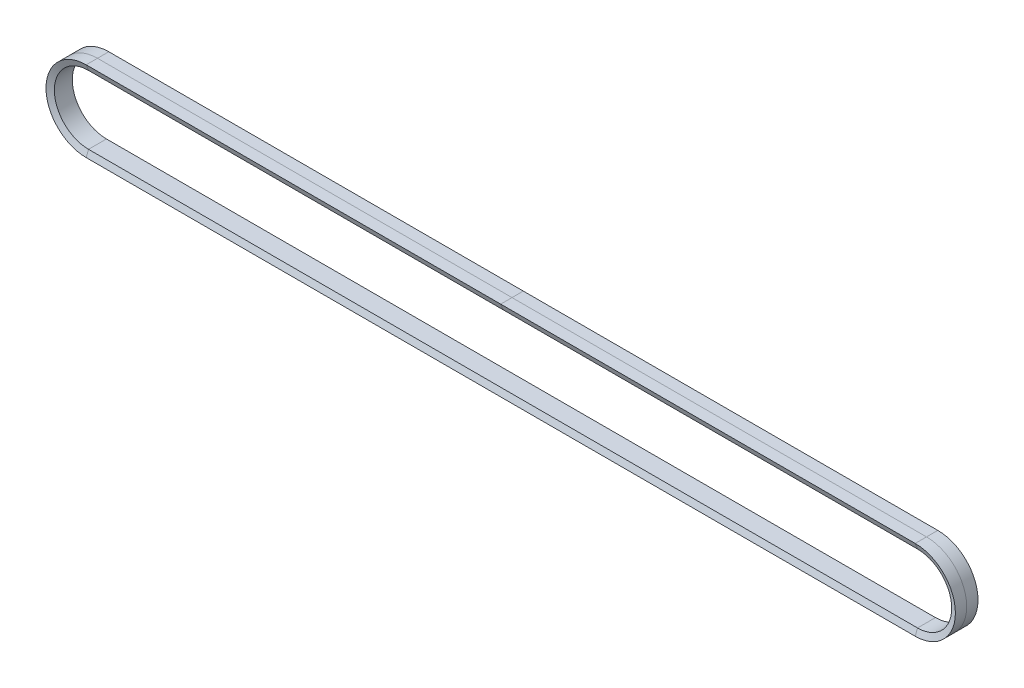
ISO-10303-21;
HEADER;
FILE_DESCRIPTION(('STEP AP214'),'2;1');
FILE_NAME('part.step','',(''),(''),'','','');
FILE_SCHEMA(('AUTOMOTIVE_DESIGN { 1 0 10303 214 1 1 1 1 }'));
ENDSEC;
DATA;
#1=APPLICATION_CONTEXT('core data for automotive mechanical design processes');
#2=APPLICATION_PROTOCOL_DEFINITION('international standard','automotive_design',2000,#1);
#3=PRODUCT_CONTEXT('',#1,'mechanical');
#4=PRODUCT('Part','Part','',(#3));
#5=PRODUCT_RELATED_PRODUCT_CATEGORY('part','',(#4));
#6=PRODUCT_DEFINITION_FORMATION('','',#4);
#7=PRODUCT_DEFINITION_CONTEXT('part definition',#1,'design');
#8=PRODUCT_DEFINITION('design','',#6,#7);
#9=PRODUCT_DEFINITION_SHAPE('','',#8);
#10=(LENGTH_UNIT() NAMED_UNIT(*) SI_UNIT(.MILLI.,.METRE.));
#11=(NAMED_UNIT(*) PLANE_ANGLE_UNIT() SI_UNIT($,.RADIAN.));
#12=(NAMED_UNIT(*) SI_UNIT($,.STERADIAN.) SOLID_ANGLE_UNIT());
#13=UNCERTAINTY_MEASURE_WITH_UNIT(LENGTH_MEASURE(1.E-05),#10,'distance_accuracy_value','');
#14=(GEOMETRIC_REPRESENTATION_CONTEXT(3) GLOBAL_UNCERTAINTY_ASSIGNED_CONTEXT((#13)) GLOBAL_UNIT_ASSIGNED_CONTEXT((#10,
#11,#12)) REPRESENTATION_CONTEXT('',''));
#15=CARTESIAN_POINT('',(0.,0.,0.));
#16=DIRECTION('',(0.,0.,1.));
#17=DIRECTION('',(1.,0.,0.));
#18=AXIS2_PLACEMENT_3D('',#15,#16,#17);
#19=CARTESIAN_POINT('',(-165.,13.5999999999999,3.57046223112381));
#20=DIRECTION('',(0.,-0.361164913100604,0.932501960075706));
#21=DIRECTION('',(0.,-0.932501960075706,-0.361164913100604));
#22=AXIS2_PLACEMENT_3D('',#19,#20,#21);
#23=PLANE('',#22);
#24=DIRECTION('',(1.,0.,0.));
#25=VECTOR('',#24,1.);
#26=CARTESIAN_POINT('',(-165.,15.9999999999999,4.5));
#27=LINE('',#26,#25);
#28=CARTESIAN_POINT('',(-165.,15.9999999999999,4.5));
#29=VERTEX_POINT('',#28);
#30=CARTESIAN_POINT('',(0.,15.9999999999999,4.5));
#31=VERTEX_POINT('',#30);
#32=EDGE_CURVE('E11',#29,#31,#27,.T.);
#33=ORIENTED_EDGE('',*,*,#32,.F.);
#34=DIRECTION('',(0.,-0.932501960075706,-0.361164913100604));
#35=VECTOR('',#34,1.);
#36=CARTESIAN_POINT('',(-165.,13.5999999999999,3.57046223112381));
#37=LINE('',#36,#35);
#38=CARTESIAN_POINT('',(-165.,13.5999999999999,3.57046223112381));
#39=VERTEX_POINT('',#38);
#40=EDGE_CURVE('E42',#29,#39,#37,.T.);
#41=ORIENTED_EDGE('',*,*,#40,.T.);
#42=DIRECTION('',(1.,0.,0.));
#43=VECTOR('',#42,1.);
#44=CARTESIAN_POINT('',(-165.,13.5999999999999,3.57046223112381));
#45=LINE('',#44,#43);
#46=CARTESIAN_POINT('',(0.,13.5999999999999,3.57046223112381));
#47=VERTEX_POINT('',#46);
#48=EDGE_CURVE('E158',#39,#47,#45,.T.);
#49=ORIENTED_EDGE('',*,*,#48,.T.);
#50=DIRECTION('',(0.,-0.932501960075706,-0.361164913100604));
#51=VECTOR('',#50,1.);
#52=CARTESIAN_POINT('',(0.,13.5999999999999,3.57046223112381));
#53=LINE('',#52,#51);
#54=EDGE_CURVE('E161',#31,#47,#53,.T.);
#55=ORIENTED_EDGE('',*,*,#54,.F.);
#56=EDGE_LOOP('',(#33,#41,#49,#55));
#57=FACE_BOUND('',#56,.T.);
#58=ADVANCED_FACE('F39',(#57),#23,.T.);
#59=CARTESIAN_POINT('',(-165.,15.9999999999999,4.5));
#60=DIRECTION('',(0.,1.,0.));
#61=DIRECTION('',(-1.,0.,0.));
#62=AXIS2_PLACEMENT_3D('',#59,#60,#61);
#63=PLANE('',#62);
#64=DIRECTION('',(1.,0.,0.));
#65=VECTOR('',#64,1.);
#66=CARTESIAN_POINT('',(-165.,15.9999999999999,0.));
#67=LINE('',#66,#65);
#68=CARTESIAN_POINT('',(-165.,15.9999999999999,0.));
#69=VERTEX_POINT('',#68);
#70=CARTESIAN_POINT('',(0.,15.9999999999999,0.));
#71=VERTEX_POINT('',#70);
#72=EDGE_CURVE('E48',#69,#71,#67,.T.);
#73=ORIENTED_EDGE('',*,*,#72,.F.);
#74=DIRECTION('',(0.,0.,1.));
#75=VECTOR('',#74,1.);
#76=CARTESIAN_POINT('',(-165.,15.9999999999999,4.5));
#77=LINE('',#76,#75);
#78=EDGE_CURVE('E304',#69,#29,#77,.T.);
#79=ORIENTED_EDGE('',*,*,#78,.T.);
#80=ORIENTED_EDGE('',*,*,#32,.T.);
#81=DIRECTION('',(0.,0.,1.));
#82=VECTOR('',#81,1.);
#83=CARTESIAN_POINT('',(0.,15.9999999999999,4.5));
#84=LINE('',#83,#82);
#85=EDGE_CURVE('E189',#71,#31,#84,.T.);
#86=ORIENTED_EDGE('',*,*,#85,.F.);
#87=EDGE_LOOP('',(#73,#79,#80,#86));
#88=FACE_BOUND('',#87,.T.);
#89=ADVANCED_FACE('F367',(#88),#63,.T.);
#90=CARTESIAN_POINT('',(-165.,15.9999999999999,0.));
#91=DIRECTION('',(0.,1.,0.));
#92=DIRECTION('',(-1.,0.,0.));
#93=AXIS2_PLACEMENT_3D('',#90,#91,#92);
#94=PLANE('',#93);
#95=DIRECTION('',(1.,0.,0.));
#96=VECTOR('',#95,1.);
#97=CARTESIAN_POINT('',(-165.,15.9999999999999,-4.5));
#98=LINE('',#97,#96);
#99=CARTESIAN_POINT('',(-165.,15.9999999999999,-4.5));
#100=VERTEX_POINT('',#99);
#101=CARTESIAN_POINT('',(0.,15.9999999999999,-4.5));
#102=VERTEX_POINT('',#101);
#103=EDGE_CURVE('E244',#100,#102,#98,.T.);
#104=ORIENTED_EDGE('',*,*,#103,.F.);
#105=DIRECTION('',(0.,0.,1.));
#106=VECTOR('',#105,1.);
#107=CARTESIAN_POINT('',(-165.,15.9999999999999,0.));
#108=LINE('',#107,#106);
#109=EDGE_CURVE('E271',#100,#69,#108,.T.);
#110=ORIENTED_EDGE('',*,*,#109,.T.);
#111=ORIENTED_EDGE('',*,*,#72,.T.);
#112=DIRECTION('',(0.,0.,1.));
#113=VECTOR('',#112,1.);
#114=CARTESIAN_POINT('',(0.,15.9999999999999,0.));
#115=LINE('',#114,#113);
#116=EDGE_CURVE('E198',#102,#71,#115,.T.);
#117=ORIENTED_EDGE('',*,*,#116,.F.);
#118=EDGE_LOOP('',(#104,#110,#111,#117));
#119=FACE_BOUND('',#118,.T.);
#120=ADVANCED_FACE('F371',(#119),#94,.T.);
#121=CARTESIAN_POINT('',(-165.,15.9999999999999,-4.5));
#122=DIRECTION('',(0.,-0.361164913100604,-0.932501960075706));
#123=DIRECTION('',(0.,0.932501960075706,-0.361164913100604));
#124=AXIS2_PLACEMENT_3D('',#121,#122,#123);
#125=PLANE('',#124);
#126=DIRECTION('',(1.,0.,0.));
#127=VECTOR('',#126,1.);
#128=CARTESIAN_POINT('',(-165.,13.5999999999999,-3.57046223112381));
#129=LINE('',#128,#127);
#130=CARTESIAN_POINT('',(-165.,13.5999999999999,-3.57046223112381));
#131=VERTEX_POINT('',#130);
#132=CARTESIAN_POINT('',(0.,13.5999999999999,-3.57046223112381));
#133=VERTEX_POINT('',#132);
#134=EDGE_CURVE('E168',#131,#133,#129,.T.);
#135=ORIENTED_EDGE('',*,*,#134,.F.);
#136=DIRECTION('',(0.,0.932501960075706,-0.361164913100604));
#137=VECTOR('',#136,1.);
#138=CARTESIAN_POINT('',(-165.,15.9999999999999,-4.5));
#139=LINE('',#138,#137);
#140=EDGE_CURVE('E238',#131,#100,#139,.T.);
#141=ORIENTED_EDGE('',*,*,#140,.T.);
#142=ORIENTED_EDGE('',*,*,#103,.T.);
#143=DIRECTION('',(0.,0.932501960075706,-0.361164913100604));
#144=VECTOR('',#143,1.);
#145=CARTESIAN_POINT('',(0.,15.9999999999999,-4.5));
#146=LINE('',#145,#144);
#147=EDGE_CURVE('E194',#133,#102,#146,.T.);
#148=ORIENTED_EDGE('',*,*,#147,.F.);
#149=EDGE_LOOP('',(#135,#141,#142,#148));
#150=FACE_BOUND('',#149,.T.);
#151=ADVANCED_FACE('F376',(#150),#125,.T.);
#152=CARTESIAN_POINT('',(-165.,0.,4.5));
#153=DIRECTION('',(0.,0.,1.));
#154=DIRECTION('',(1.,0.,0.));
#155=AXIS2_PLACEMENT_3D('',#152,#153,#154);
#156=CONICAL_SURFACE('',#155,15.9999999999999,1.20127950115753);
#157=ORIENTED_EDGE('',*,*,#40,.F.);
#158=CARTESIAN_POINT('',(-165.,0.,4.5));
#159=DIRECTION('',(0.,0.,-1.));
#160=DIRECTION('',(0.,-1.,0.));
#161=AXIS2_PLACEMENT_3D('',#158,#159,#160);
#162=CIRCLE('',#161,15.9999999999999);
#163=CARTESIAN_POINT('',(-165.,-16.,4.5));
#164=VERTEX_POINT('',#163);
#165=EDGE_CURVE('E327',#164,#29,#162,.T.);
#166=ORIENTED_EDGE('',*,*,#165,.F.);
#167=DIRECTION('',(0.,0.932501960075706,-0.361164913100604));
#168=VECTOR('',#167,1.);
#169=CARTESIAN_POINT('',(-165.,-13.6,3.57046223112381));
#170=LINE('',#169,#168);
#171=CARTESIAN_POINT('',(-165.,-13.6,3.57046223112381));
#172=VERTEX_POINT('',#171);
#173=EDGE_CURVE('E242',#164,#172,#170,.T.);
#174=ORIENTED_EDGE('',*,*,#173,.T.);
#175=CARTESIAN_POINT('',(-165.,0.,3.57046223112381));
#176=DIRECTION('',(0.,0.,-1.));
#177=DIRECTION('',(0.,-1.,0.));
#178=AXIS2_PLACEMENT_3D('',#175,#176,#177);
#179=CIRCLE('',#178,13.5999999999999);
#180=EDGE_CURVE('E234',#172,#39,#179,.T.);
#181=ORIENTED_EDGE('',*,*,#180,.T.);
#182=EDGE_LOOP('',(#157,#166,#174,#181));
#183=FACE_BOUND('',#182,.T.);
#184=ADVANCED_FACE('F341',(#183),#156,.F.);
#185=CARTESIAN_POINT('',(-165.,0.,0.));
#186=DIRECTION('',(0.,0.,-1.));
#187=DIRECTION('',(-1.,0.,0.));
#188=AXIS2_PLACEMENT_3D('',#185,#186,#187);
#189=CYLINDRICAL_SURFACE('',#188,15.9999999999999);
#190=ORIENTED_EDGE('',*,*,#165,.T.);
#191=ORIENTED_EDGE('',*,*,#78,.F.);
#192=CARTESIAN_POINT('',(-165.,0.,0.));
#193=DIRECTION('',(0.,0.,-1.));
#194=DIRECTION('',(0.,-1.,0.));
#195=AXIS2_PLACEMENT_3D('',#192,#193,#194);
#196=CIRCLE('',#195,15.9999999999999);
#197=CARTESIAN_POINT('',(-165.,-16.,0.));
#198=VERTEX_POINT('',#197);
#199=EDGE_CURVE('E300',#198,#69,#196,.T.);
#200=ORIENTED_EDGE('',*,*,#199,.F.);
#201=DIRECTION('',(0.,0.,1.));
#202=VECTOR('',#201,1.);
#203=CARTESIAN_POINT('',(-165.,-16.,4.5));
#204=LINE('',#203,#202);
#205=EDGE_CURVE('E294',#198,#164,#204,.T.);
#206=ORIENTED_EDGE('',*,*,#205,.T.);
#207=EDGE_LOOP('',(#190,#191,#200,#206));
#208=FACE_BOUND('',#207,.T.);
#209=ADVANCED_FACE('F381',(#208),#189,.T.);
#210=CARTESIAN_POINT('',(-165.,0.,0.));
#211=DIRECTION('',(0.,0.,-1.));
#212=DIRECTION('',(-1.,0.,0.));
#213=AXIS2_PLACEMENT_3D('',#210,#211,#212);
#214=CYLINDRICAL_SURFACE('',#213,15.9999999999999);
#215=ORIENTED_EDGE('',*,*,#199,.T.);
#216=ORIENTED_EDGE('',*,*,#109,.F.);
#217=CARTESIAN_POINT('',(-165.,0.,-4.5));
#218=DIRECTION('',(0.,0.,-1.));
#219=DIRECTION('',(0.,-1.,0.));
#220=AXIS2_PLACEMENT_3D('',#217,#218,#219);
#221=CIRCLE('',#220,15.9999999999999);
#222=CARTESIAN_POINT('',(-165.,-16.,-4.5));
#223=VERTEX_POINT('',#222);
#224=EDGE_CURVE('E267',#223,#100,#221,.T.);
#225=ORIENTED_EDGE('',*,*,#224,.F.);
#226=DIRECTION('',(0.,0.,1.));
#227=VECTOR('',#226,1.);
#228=CARTESIAN_POINT('',(-165.,-16.,0.));
#229=LINE('',#228,#227);
#230=EDGE_CURVE('E261',#223,#198,#229,.T.);
#231=ORIENTED_EDGE('',*,*,#230,.T.);
#232=EDGE_LOOP('',(#215,#216,#225,#231));
#233=FACE_BOUND('',#232,.T.);
#234=ADVANCED_FACE('F398',(#233),#214,.T.);
#235=CARTESIAN_POINT('',(-165.,0.,-3.57046223112381));
#236=DIRECTION('',(0.,0.,-1.));
#237=DIRECTION('',(-1.,0.,0.));
#238=AXIS2_PLACEMENT_3D('',#235,#236,#237);
#239=CONICAL_SURFACE('',#238,13.5999999999999,1.20127950115753);
#240=ORIENTED_EDGE('',*,*,#224,.T.);
#241=ORIENTED_EDGE('',*,*,#140,.F.);
#242=CARTESIAN_POINT('',(-165.,0.,-3.57046223112381));
#243=DIRECTION('',(0.,0.,-1.));
#244=DIRECTION('',(0.,-1.,0.));
#245=AXIS2_PLACEMENT_3D('',#242,#243,#244);
#246=CIRCLE('',#245,13.5999999999999);
#247=CARTESIAN_POINT('',(-165.,-13.6,-3.57046223112381));
#248=VERTEX_POINT('',#247);
#249=EDGE_CURVE('E233',#248,#131,#246,.T.);
#250=ORIENTED_EDGE('',*,*,#249,.F.);
#251=DIRECTION('',(0.,-0.932501960075706,-0.361164913100604));
#252=VECTOR('',#251,1.);
#253=CARTESIAN_POINT('',(-165.,-16.,-4.5));
#254=LINE('',#253,#252);
#255=EDGE_CURVE('E223',#248,#223,#254,.T.);
#256=ORIENTED_EDGE('',*,*,#255,.T.);
#257=EDGE_LOOP('',(#240,#241,#250,#256));
#258=FACE_BOUND('',#257,.T.);
#259=ADVANCED_FACE('F351',(#258),#239,.F.);
#260=CARTESIAN_POINT('',(-165.,0.,0.));
#261=DIRECTION('',(0.,0.,-1.));
#262=DIRECTION('',(-1.,0.,0.));
#263=AXIS2_PLACEMENT_3D('',#260,#261,#262);
#264=CYLINDRICAL_SURFACE('',#263,13.5999999999999);
#265=ORIENTED_EDGE('',*,*,#249,.T.);
#266=DIRECTION('',(0.,0.,-1.));
#267=VECTOR('',#266,1.);
#268=CARTESIAN_POINT('',(-165.,13.5999999999999,-3.57046223112381));
#269=LINE('',#268,#267);
#270=EDGE_CURVE('E230',#39,#131,#269,.T.);
#271=ORIENTED_EDGE('',*,*,#270,.F.);
#272=ORIENTED_EDGE('',*,*,#180,.F.);
#273=DIRECTION('',(0.,0.,-1.));
#274=VECTOR('',#273,1.);
#275=CARTESIAN_POINT('',(-165.,-13.6,-3.57046223112381));
#276=LINE('',#275,#274);
#277=EDGE_CURVE('E219',#172,#248,#276,.T.);
#278=ORIENTED_EDGE('',*,*,#277,.T.);
#279=EDGE_LOOP('',(#265,#271,#272,#278));
#280=FACE_BOUND('',#279,.T.);
#281=ADVANCED_FACE('F348',(#280),#264,.F.);
#282=CARTESIAN_POINT('',(165.,-13.5999999999999,3.57046223112381));
#283=DIRECTION('',(0.,0.361164913100604,0.932501960075706));
#284=DIRECTION('',(0.,-0.932501960075706,0.361164913100604));
#285=AXIS2_PLACEMENT_3D('',#282,#283,#284);
#286=PLANE('',#285);
#287=ORIENTED_EDGE('',*,*,#173,.F.);
#288=DIRECTION('',(-1.,0.,0.));
#289=VECTOR('',#288,1.);
#290=CARTESIAN_POINT('',(165.,-15.9999999999999,4.5));
#291=LINE('',#290,#289);
#292=CARTESIAN_POINT('',(165.,-15.9999999999999,4.5));
#293=VERTEX_POINT('',#292);
#294=EDGE_CURVE('E90',#293,#164,#291,.T.);
#295=ORIENTED_EDGE('',*,*,#294,.F.);
#296=DIRECTION('',(0.,0.932501960075706,-0.361164913100604));
#297=VECTOR('',#296,1.);
#298=CARTESIAN_POINT('',(165.,-13.5999999999999,3.57046223112381));
#299=LINE('',#298,#297);
#300=CARTESIAN_POINT('',(165.,-13.5999999999999,3.57046223112381));
#301=VERTEX_POINT('',#300);
#302=EDGE_CURVE('E229',#293,#301,#299,.T.);
#303=ORIENTED_EDGE('',*,*,#302,.T.);
#304=DIRECTION('',(-1.,0.,0.));
#305=VECTOR('',#304,1.);
#306=CARTESIAN_POINT('',(165.,-13.5999999999999,3.57046223112381));
#307=LINE('',#306,#305);
#308=EDGE_CURVE('E226',#301,#172,#307,.T.);
#309=ORIENTED_EDGE('',*,*,#308,.T.);
#310=EDGE_LOOP('',(#287,#295,#303,#309));
#311=FACE_BOUND('',#310,.T.);
#312=ADVANCED_FACE('F391',(#311),#286,.T.);
#313=CARTESIAN_POINT('',(165.,-15.9999999999999,4.5));
#314=DIRECTION('',(0.,-1.,0.));
#315=DIRECTION('',(1.,0.,0.));
#316=AXIS2_PLACEMENT_3D('',#313,#314,#315);
#317=PLANE('',#316);
#318=ORIENTED_EDGE('',*,*,#294,.T.);
#319=ORIENTED_EDGE('',*,*,#205,.F.);
#320=DIRECTION('',(-1.,0.,0.));
#321=VECTOR('',#320,1.);
#322=CARTESIAN_POINT('',(165.,-15.9999999999999,0.));
#323=LINE('',#322,#321);
#324=CARTESIAN_POINT('',(165.,-15.9999999999999,0.));
#325=VERTEX_POINT('',#324);
#326=EDGE_CURVE('E100',#325,#198,#323,.T.);
#327=ORIENTED_EDGE('',*,*,#326,.F.);
#328=DIRECTION('',(0.,0.,1.));
#329=VECTOR('',#328,1.);
#330=CARTESIAN_POINT('',(165.,-15.9999999999999,4.5));
#331=LINE('',#330,#329);
#332=EDGE_CURVE('E290',#325,#293,#331,.T.);
#333=ORIENTED_EDGE('',*,*,#332,.T.);
#334=EDGE_LOOP('',(#318,#319,#327,#333));
#335=FACE_BOUND('',#334,.T.);
#336=ADVANCED_FACE('F362',(#335),#317,.T.);
#337=CARTESIAN_POINT('',(165.,-15.9999999999999,0.));
#338=DIRECTION('',(0.,-1.,0.));
#339=DIRECTION('',(1.,0.,0.));
#340=AXIS2_PLACEMENT_3D('',#337,#338,#339);
#341=PLANE('',#340);
#342=ORIENTED_EDGE('',*,*,#326,.T.);
#343=ORIENTED_EDGE('',*,*,#230,.F.);
#344=DIRECTION('',(-1.,0.,0.));
#345=VECTOR('',#344,1.);
#346=CARTESIAN_POINT('',(165.,-15.9999999999999,-4.5));
#347=LINE('',#346,#345);
#348=CARTESIAN_POINT('',(165.,-15.9999999999999,-4.5));
#349=VERTEX_POINT('',#348);
#350=EDGE_CURVE('E109',#349,#223,#347,.T.);
#351=ORIENTED_EDGE('',*,*,#350,.F.);
#352=DIRECTION('',(0.,0.,1.));
#353=VECTOR('',#352,1.);
#354=CARTESIAN_POINT('',(165.,-15.9999999999999,0.));
#355=LINE('',#354,#353);
#356=EDGE_CURVE('E257',#349,#325,#355,.T.);
#357=ORIENTED_EDGE('',*,*,#356,.T.);
#358=EDGE_LOOP('',(#342,#343,#351,#357));
#359=FACE_BOUND('',#358,.T.);
#360=ADVANCED_FACE('F354',(#359),#341,.T.);
#361=CARTESIAN_POINT('',(165.,-15.9999999999999,-4.5));
#362=DIRECTION('',(0.,0.361164913100604,-0.932501960075706));
#363=DIRECTION('',(0.,0.932501960075706,0.361164913100604));
#364=AXIS2_PLACEMENT_3D('',#361,#362,#363);
#365=PLANE('',#364);
#366=ORIENTED_EDGE('',*,*,#350,.T.);
#367=ORIENTED_EDGE('',*,*,#255,.F.);
#368=DIRECTION('',(-1.,0.,0.));
#369=VECTOR('',#368,1.);
#370=CARTESIAN_POINT('',(165.,-13.5999999999999,-3.57046223112381));
#371=LINE('',#370,#369);
#372=CARTESIAN_POINT('',(165.,-13.5999999999999,-3.57046223112381));
#373=VERTEX_POINT('',#372);
#374=EDGE_CURVE('E126',#373,#248,#371,.T.);
#375=ORIENTED_EDGE('',*,*,#374,.F.);
#376=DIRECTION('',(0.,-0.932501960075706,-0.361164913100604));
#377=VECTOR('',#376,1.);
#378=CARTESIAN_POINT('',(165.,-15.9999999999999,-4.5));
#379=LINE('',#378,#377);
#380=EDGE_CURVE('E214',#373,#349,#379,.T.);
#381=ORIENTED_EDGE('',*,*,#380,.T.);
#382=EDGE_LOOP('',(#366,#367,#375,#381));
#383=FACE_BOUND('',#382,.T.);
#384=ADVANCED_FACE('F352',(#383),#365,.T.);
#385=CARTESIAN_POINT('',(165.,-13.5999999999999,-3.57046223112381));
#386=DIRECTION('',(0.,1.,0.));
#387=DIRECTION('',(-1.,0.,0.));
#388=AXIS2_PLACEMENT_3D('',#385,#386,#387);
#389=PLANE('',#388);
#390=ORIENTED_EDGE('',*,*,#374,.T.);
#391=ORIENTED_EDGE('',*,*,#277,.F.);
#392=ORIENTED_EDGE('',*,*,#308,.F.);
#393=DIRECTION('',(0.,0.,-1.));
#394=VECTOR('',#393,1.);
#395=CARTESIAN_POINT('',(165.,-13.5999999999999,-3.57046223112381));
#396=LINE('',#395,#394);
#397=EDGE_CURVE('E207',#301,#373,#396,.T.);
#398=ORIENTED_EDGE('',*,*,#397,.T.);
#399=EDGE_LOOP('',(#390,#391,#392,#398));
#400=FACE_BOUND('',#399,.T.);
#401=ADVANCED_FACE('F345',(#400),#389,.T.);
#402=CARTESIAN_POINT('',(165.,0.,4.5));
#403=DIRECTION('',(0.,0.,1.));
#404=DIRECTION('',(1.,0.,0.));
#405=AXIS2_PLACEMENT_3D('',#402,#403,#404);
#406=CONICAL_SURFACE('',#405,15.9999999999999,1.20127950115753);
#407=ORIENTED_EDGE('',*,*,#302,.F.);
#408=CARTESIAN_POINT('',(165.,0.,4.5));
#409=DIRECTION('',(0.,0.,-1.));
#410=DIRECTION('',(0.,1.,0.));
#411=AXIS2_PLACEMENT_3D('',#408,#409,#410);
#412=CIRCLE('',#411,15.9999999999999);
#413=CARTESIAN_POINT('',(165.,16.,4.5));
#414=VERTEX_POINT('',#413);
#415=EDGE_CURVE('E316',#414,#293,#412,.T.);
#416=ORIENTED_EDGE('',*,*,#415,.F.);
#417=DIRECTION('',(0.,-0.932501960075706,-0.361164913100604));
#418=VECTOR('',#417,1.);
#419=CARTESIAN_POINT('',(165.,13.6,3.57046223112381));
#420=LINE('',#419,#418);
#421=CARTESIAN_POINT('',(165.,13.6,3.57046223112381));
#422=VERTEX_POINT('',#421);
#423=EDGE_CURVE('E218',#414,#422,#420,.T.);
#424=ORIENTED_EDGE('',*,*,#423,.T.);
#425=CARTESIAN_POINT('',(165.,0.,3.57046223112381));
#426=DIRECTION('',(0.,0.,-1.));
#427=DIRECTION('',(0.,1.,0.));
#428=AXIS2_PLACEMENT_3D('',#425,#426,#427);
#429=CIRCLE('',#428,13.5999999999999);
#430=EDGE_CURVE('E211',#422,#301,#429,.T.);
#431=ORIENTED_EDGE('',*,*,#430,.T.);
#432=EDGE_LOOP('',(#407,#416,#424,#431));
#433=FACE_BOUND('',#432,.T.);
#434=ADVANCED_FACE('F360',(#433),#406,.F.);
#435=CARTESIAN_POINT('',(165.,0.,0.));
#436=DIRECTION('',(0.,0.,-1.));
#437=DIRECTION('',(-1.,0.,0.));
#438=AXIS2_PLACEMENT_3D('',#435,#436,#437);
#439=CYLINDRICAL_SURFACE('',#438,15.9999999999999);
#440=ORIENTED_EDGE('',*,*,#415,.T.);
#441=ORIENTED_EDGE('',*,*,#332,.F.);
#442=CARTESIAN_POINT('',(165.,0.,0.));
#443=DIRECTION('',(0.,0.,-1.));
#444=DIRECTION('',(0.,1.,0.));
#445=AXIS2_PLACEMENT_3D('',#442,#443,#444);
#446=CIRCLE('',#445,15.9999999999999);
#447=CARTESIAN_POINT('',(165.,16.,0.));
#448=VERTEX_POINT('',#447);
#449=EDGE_CURVE('E286',#448,#325,#446,.T.);
#450=ORIENTED_EDGE('',*,*,#449,.F.);
#451=DIRECTION('',(0.,0.,1.));
#452=VECTOR('',#451,1.);
#453=CARTESIAN_POINT('',(165.,16.,4.5));
#454=LINE('',#453,#452);
#455=EDGE_CURVE('E283',#448,#414,#454,.T.);
#456=ORIENTED_EDGE('',*,*,#455,.T.);
#457=EDGE_LOOP('',(#440,#441,#450,#456));
#458=FACE_BOUND('',#457,.T.);
#459=ADVANCED_FACE('F389',(#458),#439,.T.);
#460=CARTESIAN_POINT('',(165.,0.,0.));
#461=DIRECTION('',(0.,0.,-1.));
#462=DIRECTION('',(-1.,0.,0.));
#463=AXIS2_PLACEMENT_3D('',#460,#461,#462);
#464=CYLINDRICAL_SURFACE('',#463,15.9999999999999);
#465=ORIENTED_EDGE('',*,*,#449,.T.);
#466=ORIENTED_EDGE('',*,*,#356,.F.);
#467=CARTESIAN_POINT('',(165.,0.,-4.5));
#468=DIRECTION('',(0.,0.,-1.));
#469=DIRECTION('',(0.,1.,0.));
#470=AXIS2_PLACEMENT_3D('',#467,#468,#469);
#471=CIRCLE('',#470,15.9999999999999);
#472=CARTESIAN_POINT('',(165.,16.,-4.5));
#473=VERTEX_POINT('',#472);
#474=EDGE_CURVE('E143',#473,#349,#471,.T.);
#475=ORIENTED_EDGE('',*,*,#474,.F.);
#476=DIRECTION('',(0.,0.,1.));
#477=VECTOR('',#476,1.);
#478=CARTESIAN_POINT('',(165.,16.,0.));
#479=LINE('',#478,#477);
#480=EDGE_CURVE('E252',#473,#448,#479,.T.);
#481=ORIENTED_EDGE('',*,*,#480,.T.);
#482=EDGE_LOOP('',(#465,#466,#475,#481));
#483=FACE_BOUND('',#482,.T.);
#484=ADVANCED_FACE('F410',(#483),#464,.T.);
#485=CARTESIAN_POINT('',(165.,0.,-3.57046223112381));
#486=DIRECTION('',(0.,0.,-1.));
#487=DIRECTION('',(-1.,0.,0.));
#488=AXIS2_PLACEMENT_3D('',#485,#486,#487);
#489=CONICAL_SURFACE('',#488,13.5999999999999,1.20127950115753);
#490=ORIENTED_EDGE('',*,*,#474,.T.);
#491=ORIENTED_EDGE('',*,*,#380,.F.);
#492=CARTESIAN_POINT('',(165.,0.,-3.57046223112381));
#493=DIRECTION('',(0.,0.,-1.));
#494=DIRECTION('',(0.,1.,0.));
#495=AXIS2_PLACEMENT_3D('',#492,#493,#494);
#496=CIRCLE('',#495,13.5999999999999);
#497=CARTESIAN_POINT('',(165.,13.6,-3.57046223112381));
#498=VERTEX_POINT('',#497);
#499=EDGE_CURVE('E149',#498,#373,#496,.T.);
#500=ORIENTED_EDGE('',*,*,#499,.F.);
#501=DIRECTION('',(0.,0.932501960075706,-0.361164913100604));
#502=VECTOR('',#501,1.);
#503=CARTESIAN_POINT('',(165.,16.,-4.5));
#504=LINE('',#503,#502);
#505=EDGE_CURVE('E205',#498,#473,#504,.T.);
#506=ORIENTED_EDGE('',*,*,#505,.T.);
#507=EDGE_LOOP('',(#490,#491,#500,#506));
#508=FACE_BOUND('',#507,.T.);
#509=ADVANCED_FACE('F412',(#508),#489,.F.);
#510=CARTESIAN_POINT('',(165.,0.,0.));
#511=DIRECTION('',(0.,0.,-1.));
#512=DIRECTION('',(-1.,0.,0.));
#513=AXIS2_PLACEMENT_3D('',#510,#511,#512);
#514=CYLINDRICAL_SURFACE('',#513,13.5999999999999);
#515=ORIENTED_EDGE('',*,*,#499,.T.);
#516=ORIENTED_EDGE('',*,*,#397,.F.);
#517=ORIENTED_EDGE('',*,*,#430,.F.);
#518=DIRECTION('',(0.,0.,-1.));
#519=VECTOR('',#518,1.);
#520=CARTESIAN_POINT('',(165.,13.6,-3.57046223112381));
#521=LINE('',#520,#519);
#522=EDGE_CURVE('E179',#422,#498,#521,.T.);
#523=ORIENTED_EDGE('',*,*,#522,.T.);
#524=EDGE_LOOP('',(#515,#516,#517,#523));
#525=FACE_BOUND('',#524,.T.);
#526=ADVANCED_FACE('F386',(#525),#514,.F.);
#527=CARTESIAN_POINT('',(0.,13.5999999999999,3.57046223112381));
#528=DIRECTION('',(0.,-0.361164913100604,0.932501960075706));
#529=DIRECTION('',(0.,-0.932501960075706,-0.361164913100604));
#530=AXIS2_PLACEMENT_3D('',#527,#528,#529);
#531=PLANE('',#530);
#532=ORIENTED_EDGE('',*,*,#423,.F.);
#533=DIRECTION('',(1.,0.,0.));
#534=VECTOR('',#533,1.);
#535=CARTESIAN_POINT('',(0.,15.9999999999999,4.5));
#536=LINE('',#535,#534);
#537=EDGE_CURVE('E187',#31,#414,#536,.T.);
#538=ORIENTED_EDGE('',*,*,#537,.F.);
#539=ORIENTED_EDGE('',*,*,#54,.T.);
#540=DIRECTION('',(1.,0.,0.));
#541=VECTOR('',#540,1.);
#542=CARTESIAN_POINT('',(0.,13.5999999999999,3.57046223112381));
#543=LINE('',#542,#541);
#544=EDGE_CURVE('E174',#47,#422,#543,.T.);
#545=ORIENTED_EDGE('',*,*,#544,.T.);
#546=EDGE_LOOP('',(#532,#538,#539,#545));
#547=FACE_BOUND('',#546,.T.);
#548=ADVANCED_FACE('F185',(#547),#531,.T.);
#549=CARTESIAN_POINT('',(0.,15.9999999999999,4.5));
#550=DIRECTION('',(0.,1.,0.));
#551=DIRECTION('',(-1.,0.,0.));
#552=AXIS2_PLACEMENT_3D('',#549,#550,#551);
#553=PLANE('',#552);
#554=ORIENTED_EDGE('',*,*,#537,.T.);
#555=ORIENTED_EDGE('',*,*,#455,.F.);
#556=DIRECTION('',(1.,0.,0.));
#557=VECTOR('',#556,1.);
#558=CARTESIAN_POINT('',(0.,15.9999999999999,0.));
#559=LINE('',#558,#557);
#560=EDGE_CURVE('E279',#71,#448,#559,.T.);
#561=ORIENTED_EDGE('',*,*,#560,.F.);
#562=ORIENTED_EDGE('',*,*,#85,.T.);
#563=EDGE_LOOP('',(#554,#555,#561,#562));
#564=FACE_BOUND('',#563,.T.);
#565=ADVANCED_FACE('F385',(#564),#553,.T.);
#566=CARTESIAN_POINT('',(0.,15.9999999999999,0.));
#567=DIRECTION('',(0.,1.,0.));
#568=DIRECTION('',(-1.,0.,0.));
#569=AXIS2_PLACEMENT_3D('',#566,#567,#568);
#570=PLANE('',#569);
#571=ORIENTED_EDGE('',*,*,#560,.T.);
#572=ORIENTED_EDGE('',*,*,#480,.F.);
#573=DIRECTION('',(1.,0.,0.));
#574=VECTOR('',#573,1.);
#575=CARTESIAN_POINT('',(0.,15.9999999999999,-4.5));
#576=LINE('',#575,#574);
#577=EDGE_CURVE('E248',#102,#473,#576,.T.);
#578=ORIENTED_EDGE('',*,*,#577,.F.);
#579=ORIENTED_EDGE('',*,*,#116,.T.);
#580=EDGE_LOOP('',(#571,#572,#578,#579));
#581=FACE_BOUND('',#580,.T.);
#582=ADVANCED_FACE('F405',(#581),#570,.T.);
#583=CARTESIAN_POINT('',(0.,15.9999999999999,-4.5));
#584=DIRECTION('',(0.,-0.361164913100604,-0.932501960075706));
#585=DIRECTION('',(0.,0.932501960075706,-0.361164913100604));
#586=AXIS2_PLACEMENT_3D('',#583,#584,#585);
#587=PLANE('',#586);
#588=ORIENTED_EDGE('',*,*,#577,.T.);
#589=ORIENTED_EDGE('',*,*,#505,.F.);
#590=DIRECTION('',(1.,0.,0.));
#591=VECTOR('',#590,1.);
#592=CARTESIAN_POINT('',(0.,13.5999999999999,-3.57046223112381));
#593=LINE('',#592,#591);
#594=EDGE_CURVE('E203',#133,#498,#593,.T.);
#595=ORIENTED_EDGE('',*,*,#594,.F.);
#596=ORIENTED_EDGE('',*,*,#147,.T.);
#597=EDGE_LOOP('',(#588,#589,#595,#596));
#598=FACE_BOUND('',#597,.T.);
#599=ADVANCED_FACE('F408',(#598),#587,.T.);
#600=CARTESIAN_POINT('',(0.,13.5999999999999,-3.57046223112381));
#601=DIRECTION('',(0.,-1.,0.));
#602=DIRECTION('',(1.,0.,0.));
#603=AXIS2_PLACEMENT_3D('',#600,#601,#602);
#604=PLANE('',#603);
#605=ORIENTED_EDGE('',*,*,#594,.T.);
#606=ORIENTED_EDGE('',*,*,#522,.F.);
#607=ORIENTED_EDGE('',*,*,#544,.F.);
#608=DIRECTION('',(0.,0.,-1.));
#609=VECTOR('',#608,1.);
#610=CARTESIAN_POINT('',(0.,13.5999999999999,-3.57046223112381));
#611=LINE('',#610,#609);
#612=EDGE_CURVE('E177',#47,#133,#611,.T.);
#613=ORIENTED_EDGE('',*,*,#612,.T.);
#614=EDGE_LOOP('',(#605,#606,#607,#613));
#615=FACE_BOUND('',#614,.T.);
#616=ADVANCED_FACE('F176',(#615),#604,.T.);
#617=CARTESIAN_POINT('',(-165.,13.5999999999999,-3.57046223112381));
#618=DIRECTION('',(0.,-1.,0.));
#619=DIRECTION('',(1.,0.,0.));
#620=AXIS2_PLACEMENT_3D('',#617,#618,#619);
#621=PLANE('',#620);
#622=ORIENTED_EDGE('',*,*,#270,.T.);
#623=ORIENTED_EDGE('',*,*,#134,.T.);
#624=ORIENTED_EDGE('',*,*,#612,.F.);
#625=ORIENTED_EDGE('',*,*,#48,.F.);
#626=EDGE_LOOP('',(#622,#623,#624,#625));
#627=FACE_BOUND('',#626,.T.);
#628=ADVANCED_FACE('F191',(#627),#621,.T.);
#629=CLOSED_SHELL('',(#58,#89,#120,#151,#184,#209,#234,#259,#281,#312,#336,#360,#384,#401,#434,
#459,#484,#509,#526,#548,#565,#582,#599,#616,#628));
#630=MANIFOLD_SOLID_BREP('B2',#629);
#631=ADVANCED_BREP_SHAPE_REPRESENTATION('',(#18,#630),#14);
#632=SHAPE_DEFINITION_REPRESENTATION(#9,#631);
ENDSEC;
END-ISO-10303-21;
